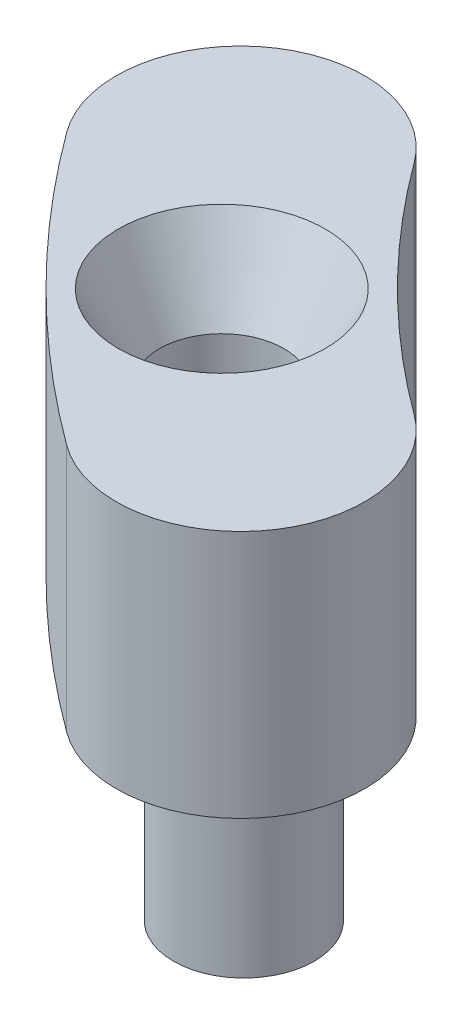
ISO-10303-21;
HEADER;
FILE_DESCRIPTION(('STEP AP214'),'2;1');
FILE_NAME('part.step','',(''),(''),'','','');
FILE_SCHEMA(('AUTOMOTIVE_DESIGN { 1 0 10303 214 1 1 1 1 }'));
ENDSEC;
DATA;
#1=APPLICATION_CONTEXT('core data for automotive mechanical design processes');
#2=APPLICATION_PROTOCOL_DEFINITION('international standard','automotive_design',2000,#1);
#3=PRODUCT_CONTEXT('',#1,'mechanical');
#4=PRODUCT('Part','Part','',(#3));
#5=PRODUCT_RELATED_PRODUCT_CATEGORY('part','',(#4));
#6=PRODUCT_DEFINITION_FORMATION('','',#4);
#7=PRODUCT_DEFINITION_CONTEXT('part definition',#1,'design');
#8=PRODUCT_DEFINITION('design','',#6,#7);
#9=PRODUCT_DEFINITION_SHAPE('','',#8);
#10=(LENGTH_UNIT() NAMED_UNIT(*) SI_UNIT(.MILLI.,.METRE.));
#11=(NAMED_UNIT(*) PLANE_ANGLE_UNIT() SI_UNIT($,.RADIAN.));
#12=(NAMED_UNIT(*) SI_UNIT($,.STERADIAN.) SOLID_ANGLE_UNIT());
#13=UNCERTAINTY_MEASURE_WITH_UNIT(LENGTH_MEASURE(1.E-05),#10,'distance_accuracy_value','');
#14=(GEOMETRIC_REPRESENTATION_CONTEXT(3) GLOBAL_UNCERTAINTY_ASSIGNED_CONTEXT((#13)) GLOBAL_UNIT_ASSIGNED_CONTEXT((#10,
#11,#12)) REPRESENTATION_CONTEXT('',''));
#15=CARTESIAN_POINT('',(0.,0.,0.));
#16=DIRECTION('',(0.,0.,1.));
#17=DIRECTION('',(1.,0.,0.));
#18=AXIS2_PLACEMENT_3D('',#15,#16,#17);
#19=CARTESIAN_POINT('',(-11.0867806011601,6.,8.13300657209492));
#20=DIRECTION('',(0.,1.,0.));
#21=DIRECTION('',(0.,0.,1.));
#22=AXIS2_PLACEMENT_3D('',#19,#20,#21);
#23=PLANE('',#22);
#24=CARTESIAN_POINT('',(-19.4454364826302,6.,19.44543648263));
#25=DIRECTION('',(0.,1.,0.));
#26=DIRECTION('',(0.,0.,1.));
#27=AXIS2_PLACEMENT_3D('',#24,#25,#26);
#28=CIRCLE('',#27,2.5);
#29=CARTESIAN_POINT('',(-19.4454364826302,6.,21.94543648263));
#30=VERTEX_POINT('',#29);
#31=EDGE_CURVE('E135',#30,#30,#28,.T.);
#32=ORIENTED_EDGE('',*,*,#31,.F.);
#33=EDGE_LOOP('',(#32));
#34=FACE_BOUND('',#33,.T.);
#35=CARTESIAN_POINT('',(-22.1735612023203,6.,16.2660131441898));
#36=DIRECTION('',(0.,1.,0.));
#37=DIRECTION('',(0.,0.,1.));
#38=AXIS2_PLACEMENT_3D('',#35,#36,#37);
#39=CIRCLE('',#38,3.);
#40=CARTESIAN_POINT('',(-19.7546272529763,6.,14.4915389830055));
#41=VERTEX_POINT('',#40);
#42=CARTESIAN_POINT('',(-24.5924951516643,6.,18.0404873053742));
#43=VERTEX_POINT('',#42);
#44=EDGE_CURVE('E96',#41,#43,#39,.T.);
#45=ORIENTED_EDGE('',*,*,#44,.T.);
#46=CARTESIAN_POINT('',(0.,6.,0.));
#47=DIRECTION('',(0.,1.,0.));
#48=DIRECTION('',(0.,0.,1.));
#49=AXIS2_PLACEMENT_3D('',#46,#47,#48);
#50=CIRCLE('',#49,30.5);
#51=CARTESIAN_POINT('',(-18.0404873053744,6.,24.5924951516641));
#52=VERTEX_POINT('',#51);
#53=EDGE_CURVE('E92',#43,#52,#50,.T.);
#54=ORIENTED_EDGE('',*,*,#53,.T.);
#55=CARTESIAN_POINT('',(-16.2660131441901,6.,22.1735612023201));
#56=DIRECTION('',(0.,1.,0.));
#57=DIRECTION('',(0.,0.,-1.));
#58=AXIS2_PLACEMENT_3D('',#55,#56,#57);
#59=CIRCLE('',#58,3.);
#60=CARTESIAN_POINT('',(-14.4915389830057,6.,19.7546272529761));
#61=VERTEX_POINT('',#60);
#62=EDGE_CURVE('E94',#52,#61,#59,.T.);
#63=ORIENTED_EDGE('',*,*,#62,.T.);
#64=CARTESIAN_POINT('',(0.,6.,0.));
#65=DIRECTION('',(0.,-1.,0.));
#66=DIRECTION('',(0.,0.,1.));
#67=AXIS2_PLACEMENT_3D('',#64,#65,#66);
#68=CIRCLE('',#67,24.5);
#69=EDGE_CURVE('E61',#61,#41,#68,.T.);
#70=ORIENTED_EDGE('',*,*,#69,.T.);
#71=EDGE_LOOP('',(#45,#54,#63,#70));
#72=FACE_BOUND('',#71,.T.);
#73=ADVANCED_FACE('F43',(#34,#72),#23,.T.);
#74=CARTESIAN_POINT('',(-11.0867806011601,0.,8.13300657209492));
#75=DIRECTION('',(0.,1.,0.));
#76=DIRECTION('',(0.,0.,1.));
#77=AXIS2_PLACEMENT_3D('',#74,#75,#76);
#78=PLANE('',#77);
#79=CARTESIAN_POINT('',(-22.3881767547989,0.,15.9693312820507));
#80=DIRECTION('',(0.,1.,0.));
#81=DIRECTION('',(0.,0.,1.));
#82=AXIS2_PLACEMENT_3D('',#79,#80,#81);
#83=CIRCLE('',#82,2.);
#84=CARTESIAN_POINT('',(-22.3881767547989,0.,17.9693312820507));
#85=VERTEX_POINT('',#84);
#86=EDGE_CURVE('E11',#85,#85,#83,.F.);
#87=ORIENTED_EDGE('',*,*,#86,.F.);
#88=EDGE_LOOP('',(#87));
#89=FACE_BOUND('',#88,.T.);
#90=CARTESIAN_POINT('',(-15.9693312820509,0.,22.3881767547987));
#91=DIRECTION('',(0.,1.,0.));
#92=DIRECTION('',(0.,0.,1.));
#93=AXIS2_PLACEMENT_3D('',#90,#91,#92);
#94=CIRCLE('',#93,1.7);
#95=CARTESIAN_POINT('',(-15.9693312820509,0.,24.0881767547987));
#96=VERTEX_POINT('',#95);
#97=EDGE_CURVE('E53',#96,#96,#94,.F.);
#98=ORIENTED_EDGE('',*,*,#97,.F.);
#99=EDGE_LOOP('',(#98));
#100=FACE_BOUND('',#99,.T.);
#101=CARTESIAN_POINT('',(-22.1735612023203,0.,16.2660131441898));
#102=DIRECTION('',(0.,1.,0.));
#103=DIRECTION('',(0.,0.,1.));
#104=AXIS2_PLACEMENT_3D('',#101,#102,#103);
#105=CIRCLE('',#104,3.);
#106=CARTESIAN_POINT('',(-19.7546272529763,0.,14.4915389830055));
#107=VERTEX_POINT('',#106);
#108=CARTESIAN_POINT('',(-24.5924951516643,0.,18.0404873053742));
#109=VERTEX_POINT('',#108);
#110=EDGE_CURVE('E115',#107,#109,#105,.T.);
#111=ORIENTED_EDGE('',*,*,#110,.F.);
#112=CARTESIAN_POINT('',(0.,0.,0.));
#113=DIRECTION('',(0.,-1.,0.));
#114=DIRECTION('',(0.,0.,1.));
#115=AXIS2_PLACEMENT_3D('',#112,#113,#114);
#116=CIRCLE('',#115,24.5);
#117=CARTESIAN_POINT('',(-14.4915389830057,0.,19.7546272529761));
#118=VERTEX_POINT('',#117);
#119=EDGE_CURVE('E84',#118,#107,#116,.T.);
#120=ORIENTED_EDGE('',*,*,#119,.F.);
#121=CARTESIAN_POINT('',(-16.2660131441901,0.,22.1735612023201));
#122=DIRECTION('',(0.,1.,0.));
#123=DIRECTION('',(0.,0.,-1.));
#124=AXIS2_PLACEMENT_3D('',#121,#122,#123);
#125=CIRCLE('',#124,3.);
#126=CARTESIAN_POINT('',(-18.0404873053744,0.,24.5924951516641));
#127=VERTEX_POINT('',#126);
#128=EDGE_CURVE('E78',#127,#118,#125,.T.);
#129=ORIENTED_EDGE('',*,*,#128,.F.);
#130=CARTESIAN_POINT('',(0.,0.,0.));
#131=DIRECTION('',(0.,1.,0.));
#132=DIRECTION('',(0.,0.,1.));
#133=AXIS2_PLACEMENT_3D('',#130,#131,#132);
#134=CIRCLE('',#133,30.5);
#135=EDGE_CURVE('E102',#109,#127,#134,.T.);
#136=ORIENTED_EDGE('',*,*,#135,.F.);
#137=EDGE_LOOP('',(#111,#120,#129,#136));
#138=FACE_BOUND('',#137,.T.);
#139=CARTESIAN_POINT('',(-19.4454364826302,0.,19.44543648263));
#140=DIRECTION('',(0.,1.,0.));
#141=DIRECTION('',(0.,0.,1.));
#142=AXIS2_PLACEMENT_3D('',#139,#140,#141);
#143=CIRCLE('',#142,1.5);
#144=CARTESIAN_POINT('',(-19.4454364826302,0.,20.94543648263));
#145=VERTEX_POINT('',#144);
#146=EDGE_CURVE('E119',#145,#145,#143,.T.);
#147=ORIENTED_EDGE('',*,*,#146,.T.);
#148=EDGE_LOOP('',(#147));
#149=FACE_BOUND('',#148,.T.);
#150=ADVANCED_FACE('F142',(#89,#100,#138,#149),#78,.F.);
#151=CARTESIAN_POINT('',(-22.1735612023203,6.,16.2660131441898));
#152=DIRECTION('',(0.,-1.,0.));
#153=DIRECTION('',(0.,0.,-1.));
#154=AXIS2_PLACEMENT_3D('',#151,#152,#153);
#155=CYLINDRICAL_SURFACE('',#154,3.);
#156=ORIENTED_EDGE('',*,*,#110,.T.);
#157=DIRECTION('',(0.,-1.,0.));
#158=VECTOR('',#157,1.);
#159=CARTESIAN_POINT('',(-24.5924951516643,6.,18.0404873053742));
#160=LINE('',#159,#158);
#161=EDGE_CURVE('E104',#43,#109,#160,.T.);
#162=ORIENTED_EDGE('',*,*,#161,.F.);
#163=ORIENTED_EDGE('',*,*,#44,.F.);
#164=DIRECTION('',(0.,-1.,0.));
#165=VECTOR('',#164,1.);
#166=CARTESIAN_POINT('',(-19.7546272529763,6.,14.4915389830055));
#167=LINE('',#166,#165);
#168=EDGE_CURVE('E111',#41,#107,#167,.T.);
#169=ORIENTED_EDGE('',*,*,#168,.T.);
#170=EDGE_LOOP('',(#156,#162,#163,#169));
#171=FACE_BOUND('',#170,.T.);
#172=ADVANCED_FACE('F45',(#171),#155,.T.);
#173=CARTESIAN_POINT('',(0.,6.,0.));
#174=DIRECTION('',(0.,-1.,0.));
#175=DIRECTION('',(0.,0.,-1.));
#176=AXIS2_PLACEMENT_3D('',#173,#174,#175);
#177=CYLINDRICAL_SURFACE('',#176,30.5);
#178=ORIENTED_EDGE('',*,*,#135,.T.);
#179=DIRECTION('',(0.,-1.,0.));
#180=VECTOR('',#179,1.);
#181=CARTESIAN_POINT('',(-18.0404873053744,6.,24.5924951516641));
#182=LINE('',#181,#180);
#183=EDGE_CURVE('E100',#52,#127,#182,.T.);
#184=ORIENTED_EDGE('',*,*,#183,.F.);
#185=ORIENTED_EDGE('',*,*,#53,.F.);
#186=ORIENTED_EDGE('',*,*,#161,.T.);
#187=EDGE_LOOP('',(#178,#184,#185,#186));
#188=FACE_BOUND('',#187,.T.);
#189=ADVANCED_FACE('F101',(#188),#177,.T.);
#190=CARTESIAN_POINT('',(-16.2660131441901,6.,22.1735612023201));
#191=DIRECTION('',(0.,-1.,0.));
#192=DIRECTION('',(0.,0.,-1.));
#193=AXIS2_PLACEMENT_3D('',#190,#191,#192);
#194=CYLINDRICAL_SURFACE('',#193,3.);
#195=ORIENTED_EDGE('',*,*,#128,.T.);
#196=DIRECTION('',(0.,-1.,0.));
#197=VECTOR('',#196,1.);
#198=CARTESIAN_POINT('',(-14.4915389830057,6.,19.7546272529761));
#199=LINE('',#198,#197);
#200=EDGE_CURVE('E105',#61,#118,#199,.T.);
#201=ORIENTED_EDGE('',*,*,#200,.F.);
#202=ORIENTED_EDGE('',*,*,#62,.F.);
#203=ORIENTED_EDGE('',*,*,#183,.T.);
#204=EDGE_LOOP('',(#195,#201,#202,#203));
#205=FACE_BOUND('',#204,.T.);
#206=ADVANCED_FACE('F107',(#205),#194,.T.);
#207=CARTESIAN_POINT('',(0.,6.,0.));
#208=DIRECTION('',(0.,-1.,0.));
#209=DIRECTION('',(0.,0.,-1.));
#210=AXIS2_PLACEMENT_3D('',#207,#208,#209);
#211=CYLINDRICAL_SURFACE('',#210,24.5);
#212=ORIENTED_EDGE('',*,*,#119,.T.);
#213=ORIENTED_EDGE('',*,*,#168,.F.);
#214=ORIENTED_EDGE('',*,*,#69,.F.);
#215=ORIENTED_EDGE('',*,*,#200,.T.);
#216=EDGE_LOOP('',(#212,#213,#214,#215));
#217=FACE_BOUND('',#216,.T.);
#218=ADVANCED_FACE('F193',(#217),#211,.F.);
#219=CARTESIAN_POINT('',(-19.4454364826302,6.,19.44543648263));
#220=DIRECTION('',(0.,-1.,0.));
#221=DIRECTION('',(0.,0.,-1.));
#222=AXIS2_PLACEMENT_3D('',#219,#220,#221);
#223=CYLINDRICAL_SURFACE('',#222,1.5);
#224=CARTESIAN_POINT('',(-19.4454364826302,3.99999999999999,19.44543648263));
#225=DIRECTION('',(0.,1.,0.));
#226=DIRECTION('',(0.,0.,1.));
#227=AXIS2_PLACEMENT_3D('',#224,#225,#226);
#228=CIRCLE('',#227,1.5);
#229=CARTESIAN_POINT('',(-19.4454364826302,3.99999999999999,20.94543648263));
#230=VERTEX_POINT('',#229);
#231=EDGE_CURVE('E132',#230,#230,#228,.F.);
#232=ORIENTED_EDGE('',*,*,#231,.F.);
#233=EDGE_LOOP('',(#232));
#234=FACE_BOUND('',#233,.T.);
#235=ORIENTED_EDGE('',*,*,#146,.F.);
#236=EDGE_LOOP('',(#235));
#237=FACE_BOUND('',#236,.T.);
#238=ADVANCED_FACE('F190',(#234,#237),#223,.F.);
#239=CARTESIAN_POINT('',(-19.4454364826302,6.,19.44543648263));
#240=DIRECTION('',(0.,1.,0.));
#241=DIRECTION('',(0.,0.,1.));
#242=AXIS2_PLACEMENT_3D('',#239,#240,#241);
#243=CONICAL_SURFACE('',#242,2.5,0.463647609000805);
#244=ORIENTED_EDGE('',*,*,#231,.T.);
#245=EDGE_LOOP('',(#244));
#246=FACE_BOUND('',#245,.T.);
#247=ORIENTED_EDGE('',*,*,#31,.T.);
#248=EDGE_LOOP('',(#247));
#249=FACE_BOUND('',#248,.T.);
#250=ADVANCED_FACE('F216',(#246,#249),#243,.F.);
#251=CARTESIAN_POINT('',(-15.9693312820509,-4.,22.3881767547987));
#252=DIRECTION('',(0.,1.,0.));
#253=DIRECTION('',(0.,0.,1.));
#254=AXIS2_PLACEMENT_3D('',#251,#252,#253);
#255=CYLINDRICAL_SURFACE('',#254,1.7);
#256=CARTESIAN_POINT('',(-15.9693312820509,-4.,22.3881767547987));
#257=DIRECTION('',(0.,-1.,0.));
#258=DIRECTION('',(0.,0.,-1.));
#259=AXIS2_PLACEMENT_3D('',#256,#257,#258);
#260=CIRCLE('',#259,1.7);
#261=CARTESIAN_POINT('',(-15.9693312820509,-4.,20.6881767547987));
#262=VERTEX_POINT('',#261);
#263=EDGE_CURVE('E159',#262,#262,#260,.T.);
#264=ORIENTED_EDGE('',*,*,#263,.F.);
#265=EDGE_LOOP('',(#264));
#266=FACE_BOUND('',#265,.T.);
#267=ORIENTED_EDGE('',*,*,#97,.T.);
#268=EDGE_LOOP('',(#267));
#269=FACE_BOUND('',#268,.T.);
#270=ADVANCED_FACE('F140',(#266,#269),#255,.T.);
#271=CARTESIAN_POINT('',(-15.9693312820509,-4.,22.3881767547987));
#272=DIRECTION('',(0.,-1.,0.));
#273=DIRECTION('',(0.,0.,-1.));
#274=AXIS2_PLACEMENT_3D('',#271,#272,#273);
#275=PLANE('',#274);
#276=ORIENTED_EDGE('',*,*,#263,.T.);
#277=EDGE_LOOP('',(#276));
#278=FACE_BOUND('',#277,.T.);
#279=ADVANCED_FACE('F173',(#278),#275,.T.);
#280=CARTESIAN_POINT('',(-22.3881767547989,-4.,15.9693312820507));
#281=DIRECTION('',(0.,1.,0.));
#282=DIRECTION('',(0.,0.,1.));
#283=AXIS2_PLACEMENT_3D('',#280,#281,#282);
#284=CYLINDRICAL_SURFACE('',#283,2.);
#285=CARTESIAN_POINT('',(-22.3881767547989,-4.,15.9693312820507));
#286=DIRECTION('',(0.,-1.,0.));
#287=DIRECTION('',(0.,0.,-1.));
#288=AXIS2_PLACEMENT_3D('',#285,#286,#287);
#289=CIRCLE('',#288,2.);
#290=CARTESIAN_POINT('',(-22.3881767547989,-4.,13.9693312820507));
#291=VERTEX_POINT('',#290);
#292=EDGE_CURVE('E163',#291,#291,#289,.T.);
#293=ORIENTED_EDGE('',*,*,#292,.F.);
#294=EDGE_LOOP('',(#293));
#295=FACE_BOUND('',#294,.T.);
#296=ORIENTED_EDGE('',*,*,#86,.T.);
#297=EDGE_LOOP('',(#296));
#298=FACE_BOUND('',#297,.T.);
#299=ADVANCED_FACE('F170',(#295,#298),#284,.T.);
#300=CARTESIAN_POINT('',(-22.3881767547989,-4.,15.9693312820507));
#301=DIRECTION('',(0.,-1.,0.));
#302=DIRECTION('',(0.,0.,-1.));
#303=AXIS2_PLACEMENT_3D('',#300,#301,#302);
#304=PLANE('',#303);
#305=ORIENTED_EDGE('',*,*,#292,.T.);
#306=EDGE_LOOP('',(#305));
#307=FACE_BOUND('',#306,.T.);
#308=ADVANCED_FACE('F168',(#307),#304,.T.);
#309=CLOSED_SHELL('',(#73,#150,#172,#189,#206,#218,#238,#250,#270,#279,#299,#308));
#310=MANIFOLD_SOLID_BREP('B2',#309);
#311=ADVANCED_BREP_SHAPE_REPRESENTATION('',(#18,#310),#14);
#312=SHAPE_DEFINITION_REPRESENTATION(#9,#311);
ENDSEC;
END-ISO-10303-21;
